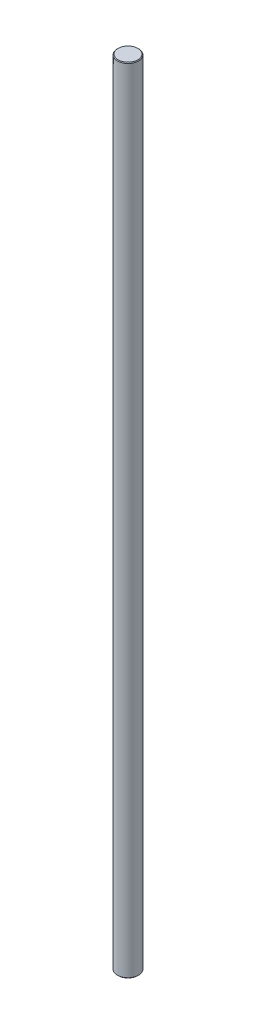
ISO-10303-21;
HEADER;
FILE_DESCRIPTION(('STEP AP214'),'2;1');
FILE_NAME('part.step','',(''),(''),'','','');
FILE_SCHEMA(('AUTOMOTIVE_DESIGN { 1 0 10303 214 1 1 1 1 }'));
ENDSEC;
DATA;
#1=APPLICATION_CONTEXT('core data for automotive mechanical design processes');
#2=APPLICATION_PROTOCOL_DEFINITION('international standard','automotive_design',2000,#1);
#3=PRODUCT_CONTEXT('',#1,'mechanical');
#4=PRODUCT('Part','Part','',(#3));
#5=PRODUCT_RELATED_PRODUCT_CATEGORY('part','',(#4));
#6=PRODUCT_DEFINITION_FORMATION('','',#4);
#7=PRODUCT_DEFINITION_CONTEXT('part definition',#1,'design');
#8=PRODUCT_DEFINITION('design','',#6,#7);
#9=PRODUCT_DEFINITION_SHAPE('','',#8);
#10=(LENGTH_UNIT() NAMED_UNIT(*) SI_UNIT(.MILLI.,.METRE.));
#11=(NAMED_UNIT(*) PLANE_ANGLE_UNIT() SI_UNIT($,.RADIAN.));
#12=(NAMED_UNIT(*) SI_UNIT($,.STERADIAN.) SOLID_ANGLE_UNIT());
#13=UNCERTAINTY_MEASURE_WITH_UNIT(LENGTH_MEASURE(1.E-05),#10,'distance_accuracy_value','');
#14=(GEOMETRIC_REPRESENTATION_CONTEXT(3) GLOBAL_UNCERTAINTY_ASSIGNED_CONTEXT((#13)) GLOBAL_UNIT_ASSIGNED_CONTEXT((#10,
#11,#12)) REPRESENTATION_CONTEXT('',''));
#15=CARTESIAN_POINT('',(0.,0.,0.));
#16=DIRECTION('',(0.,0.,1.));
#17=DIRECTION('',(1.,0.,0.));
#18=AXIS2_PLACEMENT_3D('',#15,#16,#17);
#19=CARTESIAN_POINT('',(-19.4218067225362,300.,-6.00759275739468));
#20=DIRECTION('',(0.,-1.,0.));
#21=DIRECTION('',(0.,0.,-1.));
#22=AXIS2_PLACEMENT_3D('',#19,#20,#21);
#23=CYLINDRICAL_SURFACE('',#22,4.);
#24=CARTESIAN_POINT('',(-19.4218067225362,299.75,-6.00759275739468));
#25=DIRECTION('',(0.,1.,0.));
#26=DIRECTION('',(0.,0.,1.));
#27=AXIS2_PLACEMENT_3D('',#24,#25,#26);
#28=CIRCLE('',#27,4.);
#29=CARTESIAN_POINT('',(-19.4218067225362,299.75,-2.00759275739468));
#30=VERTEX_POINT('',#29);
#31=EDGE_CURVE('E38',#30,#30,#28,.F.);
#32=ORIENTED_EDGE('',*,*,#31,.T.);
#33=EDGE_LOOP('',(#32));
#34=FACE_BOUND('',#33,.T.);
#35=CARTESIAN_POINT('',(-19.4218067225362,0.249999999999972,-6.00759275739468));
#36=DIRECTION('',(0.,1.,0.));
#37=DIRECTION('',(0.,0.,1.));
#38=AXIS2_PLACEMENT_3D('',#35,#36,#37);
#39=CIRCLE('',#38,4.);
#40=CARTESIAN_POINT('',(-19.4218067225362,0.249999999999972,-2.00759275739468));
#41=VERTEX_POINT('',#40);
#42=EDGE_CURVE('E42',#41,#41,#39,.T.);
#43=ORIENTED_EDGE('',*,*,#42,.T.);
#44=EDGE_LOOP('',(#43));
#45=FACE_BOUND('',#44,.T.);
#46=ADVANCED_FACE('F31',(#34,#45),#23,.T.);
#47=CARTESIAN_POINT('',(-19.4218067225362,300.,-6.00759275739468));
#48=DIRECTION('',(0.,1.,0.));
#49=DIRECTION('',(0.,0.,1.));
#50=AXIS2_PLACEMENT_3D('',#47,#48,#49);
#51=PLANE('',#50);
#52=CARTESIAN_POINT('',(-19.4218067225362,300.,-6.00759275739468));
#53=DIRECTION('',(0.,1.,0.));
#54=DIRECTION('',(0.,0.,1.));
#55=AXIS2_PLACEMENT_3D('',#52,#53,#54);
#56=CIRCLE('',#55,3.75);
#57=CARTESIAN_POINT('',(-19.4218067225362,300.,-2.25759275739468));
#58=VERTEX_POINT('',#57);
#59=EDGE_CURVE('E46',#58,#58,#56,.T.);
#60=ORIENTED_EDGE('',*,*,#59,.T.);
#61=EDGE_LOOP('',(#60));
#62=FACE_BOUND('',#61,.T.);
#63=ADVANCED_FACE('F52',(#62),#51,.T.);
#64=CARTESIAN_POINT('',(-19.4218067225362,0.,-6.00759275739468));
#65=DIRECTION('',(0.,1.,0.));
#66=DIRECTION('',(0.,0.,1.));
#67=AXIS2_PLACEMENT_3D('',#64,#65,#66);
#68=PLANE('',#67);
#69=CARTESIAN_POINT('',(-19.4218067225362,0.,-6.00759275739468));
#70=DIRECTION('',(0.,1.,0.));
#71=DIRECTION('',(0.,0.,1.));
#72=AXIS2_PLACEMENT_3D('',#69,#70,#71);
#73=CIRCLE('',#72,3.75);
#74=CARTESIAN_POINT('',(-19.4218067225362,0.,-2.25759275739468));
#75=VERTEX_POINT('',#74);
#76=EDGE_CURVE('E10',#75,#75,#73,.F.);
#77=ORIENTED_EDGE('',*,*,#76,.T.);
#78=EDGE_LOOP('',(#77));
#79=FACE_BOUND('',#78,.T.);
#80=ADVANCED_FACE('F56',(#79),#68,.F.);
#81=CARTESIAN_POINT('',(-19.4218067225362,300.,-6.00759275739468));
#82=DIRECTION('',(0.,-1.,0.));
#83=DIRECTION('',(0.,0.,-1.));
#84=AXIS2_PLACEMENT_3D('',#81,#82,#83);
#85=CONICAL_SURFACE('',#84,3.75,0.785398163397388);
#86=ORIENTED_EDGE('',*,*,#31,.F.);
#87=EDGE_LOOP('',(#86));
#88=FACE_BOUND('',#87,.T.);
#89=ORIENTED_EDGE('',*,*,#59,.F.);
#90=EDGE_LOOP('',(#89));
#91=FACE_BOUND('',#90,.T.);
#92=ADVANCED_FACE('F54',(#88,#91),#85,.T.);
#93=CARTESIAN_POINT('',(-19.4218067225362,0.249999999999972,-6.00759275739468));
#94=DIRECTION('',(0.,1.,0.));
#95=DIRECTION('',(0.,0.,1.));
#96=AXIS2_PLACEMENT_3D('',#93,#94,#95);
#97=CONICAL_SURFACE('',#96,4.,0.785398163397499);
#98=ORIENTED_EDGE('',*,*,#76,.F.);
#99=EDGE_LOOP('',(#98));
#100=FACE_BOUND('',#99,.T.);
#101=ORIENTED_EDGE('',*,*,#42,.F.);
#102=EDGE_LOOP('',(#101));
#103=FACE_BOUND('',#102,.T.);
#104=ADVANCED_FACE('F33',(#100,#103),#97,.T.);
#105=CLOSED_SHELL('',(#46,#63,#80,#92,#104));
#106=MANIFOLD_SOLID_BREP('B2',#105);
#107=ADVANCED_BREP_SHAPE_REPRESENTATION('',(#18,#106),#14);
#108=SHAPE_DEFINITION_REPRESENTATION(#9,#107);
ENDSEC;
END-ISO-10303-21;
